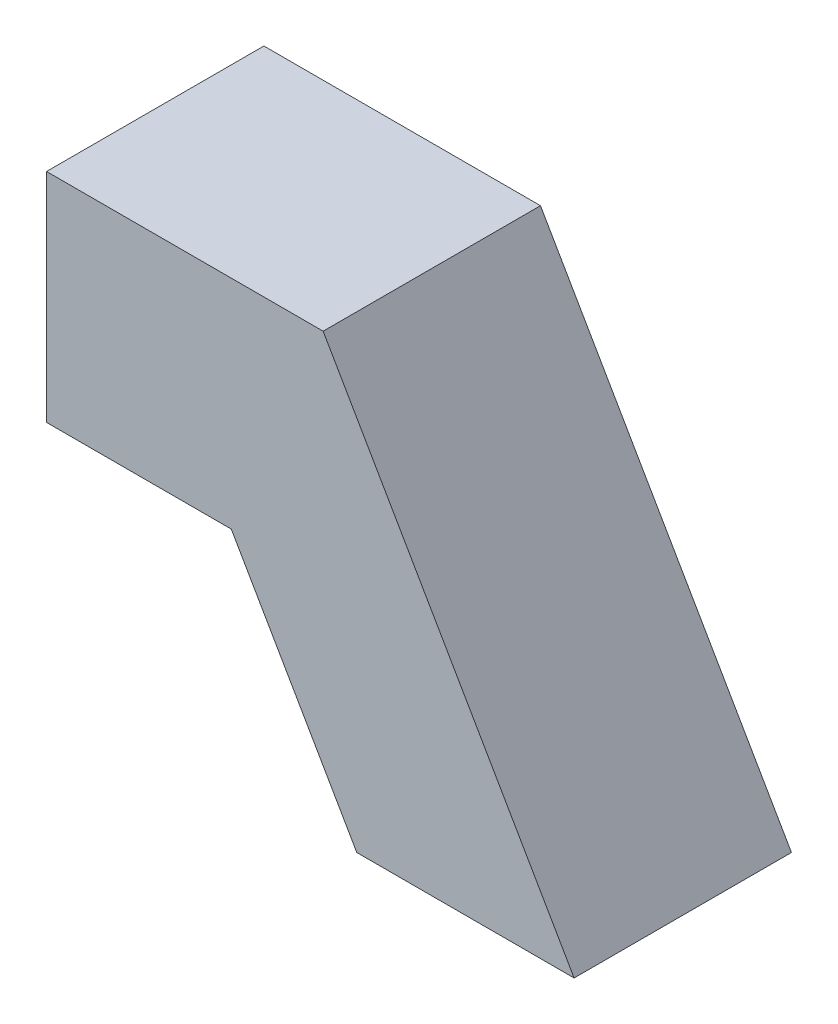
ISO-10303-21;
HEADER;
FILE_DESCRIPTION(('STEP AP214'),'2;1');
FILE_NAME('part.step','',(''),(''),'','','');
FILE_SCHEMA(('AUTOMOTIVE_DESIGN { 1 0 10303 214 1 1 1 1 }'));
ENDSEC;
DATA;
#1=APPLICATION_CONTEXT('core data for automotive mechanical design processes');
#2=APPLICATION_PROTOCOL_DEFINITION('international standard','automotive_design',2000,#1);
#3=PRODUCT_CONTEXT('',#1,'mechanical');
#4=PRODUCT('Part','Part','',(#3));
#5=PRODUCT_RELATED_PRODUCT_CATEGORY('part','',(#4));
#6=PRODUCT_DEFINITION_FORMATION('','',#4);
#7=PRODUCT_DEFINITION_CONTEXT('part definition',#1,'design');
#8=PRODUCT_DEFINITION('design','',#6,#7);
#9=PRODUCT_DEFINITION_SHAPE('','',#8);
#10=(LENGTH_UNIT() NAMED_UNIT(*) SI_UNIT(.MILLI.,.METRE.));
#11=(NAMED_UNIT(*) PLANE_ANGLE_UNIT() SI_UNIT($,.RADIAN.));
#12=(NAMED_UNIT(*) SI_UNIT($,.STERADIAN.) SOLID_ANGLE_UNIT());
#13=UNCERTAINTY_MEASURE_WITH_UNIT(LENGTH_MEASURE(1.E-05),#10,'distance_accuracy_value','');
#14=(GEOMETRIC_REPRESENTATION_CONTEXT(3) GLOBAL_UNCERTAINTY_ASSIGNED_CONTEXT((#13)) GLOBAL_UNIT_ASSIGNED_CONTEXT((#10,
#11,#12)) REPRESENTATION_CONTEXT('',''));
#15=CARTESIAN_POINT('',(0.,0.,0.));
#16=DIRECTION('',(0.,0.,1.));
#17=DIRECTION('',(1.,0.,0.));
#18=AXIS2_PLACEMENT_3D('',#15,#16,#17);
#19=CARTESIAN_POINT('',(0.,0.,20.));
#20=DIRECTION('',(0.,1.,0.));
#21=DIRECTION('',(0.,0.,1.));
#22=AXIS2_PLACEMENT_3D('',#19,#20,#21);
#23=PLANE('',#22);
#24=DIRECTION('',(1.,0.,0.));
#25=VECTOR('',#24,1.);
#26=CARTESIAN_POINT('',(0.,0.,0.));
#27=LINE('',#26,#25);
#28=CARTESIAN_POINT('',(0.,0.,0.));
#29=VERTEX_POINT('',#28);
#30=CARTESIAN_POINT('',(17.,0.,0.));
#31=VERTEX_POINT('',#30);
#32=EDGE_CURVE('E134',#29,#31,#27,.T.);
#33=ORIENTED_EDGE('',*,*,#32,.T.);
#34=DIRECTION('',(0.,0.,-1.));
#35=VECTOR('',#34,1.);
#36=CARTESIAN_POINT('',(17.,0.,20.));
#37=LINE('',#36,#35);
#38=CARTESIAN_POINT('',(17.,0.,20.));
#39=VERTEX_POINT('',#38);
#40=EDGE_CURVE('E11',#39,#31,#37,.T.);
#41=ORIENTED_EDGE('',*,*,#40,.F.);
#42=DIRECTION('',(1.,0.,0.));
#43=VECTOR('',#42,1.);
#44=CARTESIAN_POINT('',(0.,0.,20.));
#45=LINE('',#44,#43);
#46=CARTESIAN_POINT('',(0.,0.,20.));
#47=VERTEX_POINT('',#46);
#48=EDGE_CURVE('E150',#47,#39,#45,.T.);
#49=ORIENTED_EDGE('',*,*,#48,.F.);
#50=DIRECTION('',(0.,0.,-1.));
#51=VECTOR('',#50,1.);
#52=CARTESIAN_POINT('',(0.,0.,20.));
#53=LINE('',#52,#51);
#54=EDGE_CURVE('E130',#47,#29,#53,.T.);
#55=ORIENTED_EDGE('',*,*,#54,.T.);
#56=EDGE_LOOP('',(#33,#41,#49,#55));
#57=FACE_BOUND('',#56,.T.);
#58=ADVANCED_FACE('F45',(#57),#23,.F.);
#59=CARTESIAN_POINT('',(17.,0.,20.));
#60=DIRECTION('',(0.86602540378444,0.499999999999998,0.));
#61=DIRECTION('',(-0.499999999999998,0.86602540378444,0.));
#62=AXIS2_PLACEMENT_3D('',#59,#60,#61);
#63=PLANE('',#62);
#64=DIRECTION('',(0.499999999999998,-0.86602540378444,0.));
#65=VECTOR('',#64,1.);
#66=CARTESIAN_POINT('',(17.,0.,0.));
#67=LINE('',#66,#65);
#68=CARTESIAN_POINT('',(28.5470053837925,-20.,0.));
#69=VERTEX_POINT('',#68);
#70=EDGE_CURVE('E138',#31,#69,#67,.T.);
#71=ORIENTED_EDGE('',*,*,#70,.T.);
#72=DIRECTION('',(0.,0.,-1.));
#73=VECTOR('',#72,1.);
#74=CARTESIAN_POINT('',(28.5470053837925,-20.,20.));
#75=LINE('',#74,#73);
#76=CARTESIAN_POINT('',(28.5470053837925,-20.,20.));
#77=VERTEX_POINT('',#76);
#78=EDGE_CURVE('E54',#77,#69,#75,.T.);
#79=ORIENTED_EDGE('',*,*,#78,.F.);
#80=DIRECTION('',(0.499999999999998,-0.86602540378444,0.));
#81=VECTOR('',#80,1.);
#82=CARTESIAN_POINT('',(17.,0.,20.));
#83=LINE('',#82,#81);
#84=EDGE_CURVE('E99',#39,#77,#83,.T.);
#85=ORIENTED_EDGE('',*,*,#84,.F.);
#86=ORIENTED_EDGE('',*,*,#40,.T.);
#87=EDGE_LOOP('',(#71,#79,#85,#86));
#88=FACE_BOUND('',#87,.T.);
#89=ADVANCED_FACE('F178',(#88),#63,.F.);
#90=CARTESIAN_POINT('',(48.5470053837925,-20.,20.));
#91=DIRECTION('',(0.,1.,0.));
#92=DIRECTION('',(0.,0.,1.));
#93=AXIS2_PLACEMENT_3D('',#90,#91,#92);
#94=PLANE('',#93);
#95=DIRECTION('',(1.,0.,0.));
#96=VECTOR('',#95,1.);
#97=CARTESIAN_POINT('',(48.5470053837925,-20.,0.));
#98=LINE('',#97,#96);
#99=CARTESIAN_POINT('',(48.5470053837925,-20.,0.));
#100=VERTEX_POINT('',#99);
#101=EDGE_CURVE('E141',#69,#100,#98,.T.);
#102=ORIENTED_EDGE('',*,*,#101,.T.);
#103=DIRECTION('',(0.,0.,-1.));
#104=VECTOR('',#103,1.);
#105=CARTESIAN_POINT('',(48.5470053837925,-20.,20.));
#106=LINE('',#105,#104);
#107=CARTESIAN_POINT('',(48.5470053837925,-20.,20.));
#108=VERTEX_POINT('',#107);
#109=EDGE_CURVE('E123',#108,#100,#106,.T.);
#110=ORIENTED_EDGE('',*,*,#109,.F.);
#111=DIRECTION('',(1.,0.,0.));
#112=VECTOR('',#111,1.);
#113=CARTESIAN_POINT('',(48.5470053837925,-20.,20.));
#114=LINE('',#113,#112);
#115=EDGE_CURVE('E112',#77,#108,#114,.T.);
#116=ORIENTED_EDGE('',*,*,#115,.F.);
#117=ORIENTED_EDGE('',*,*,#78,.T.);
#118=EDGE_LOOP('',(#102,#110,#116,#117));
#119=FACE_BOUND('',#118,.T.);
#120=ADVANCED_FACE('F160',(#119),#94,.F.);
#121=CARTESIAN_POINT('',(25.4529946162076,20.,20.));
#122=DIRECTION('',(-0.86602540378444,-0.499999999999998,0.));
#123=DIRECTION('',(0.499999999999998,-0.86602540378444,0.));
#124=AXIS2_PLACEMENT_3D('',#121,#122,#123);
#125=PLANE('',#124);
#126=DIRECTION('',(-0.499999999999998,0.86602540378444,0.));
#127=VECTOR('',#126,1.);
#128=CARTESIAN_POINT('',(25.4529946162076,20.,0.));
#129=LINE('',#128,#127);
#130=CARTESIAN_POINT('',(25.4529946162076,20.,0.));
#131=VERTEX_POINT('',#130);
#132=EDGE_CURVE('E121',#100,#131,#129,.T.);
#133=ORIENTED_EDGE('',*,*,#132,.T.);
#134=DIRECTION('',(0.,0.,-1.));
#135=VECTOR('',#134,1.);
#136=CARTESIAN_POINT('',(25.4529946162076,20.,20.));
#137=LINE('',#136,#135);
#138=CARTESIAN_POINT('',(25.4529946162076,20.,20.));
#139=VERTEX_POINT('',#138);
#140=EDGE_CURVE('E118',#139,#131,#137,.T.);
#141=ORIENTED_EDGE('',*,*,#140,.F.);
#142=DIRECTION('',(-0.499999999999998,0.86602540378444,0.));
#143=VECTOR('',#142,1.);
#144=CARTESIAN_POINT('',(25.4529946162076,20.,20.));
#145=LINE('',#144,#143);
#146=EDGE_CURVE('E106',#108,#139,#145,.T.);
#147=ORIENTED_EDGE('',*,*,#146,.F.);
#148=ORIENTED_EDGE('',*,*,#109,.T.);
#149=EDGE_LOOP('',(#133,#141,#147,#148));
#150=FACE_BOUND('',#149,.T.);
#151=ADVANCED_FACE('F119',(#150),#125,.F.);
#152=CARTESIAN_POINT('',(0.,20.,20.));
#153=DIRECTION('',(0.,-1.,0.));
#154=DIRECTION('',(0.,0.,-1.));
#155=AXIS2_PLACEMENT_3D('',#152,#153,#154);
#156=PLANE('',#155);
#157=DIRECTION('',(-1.,0.,0.));
#158=VECTOR('',#157,1.);
#159=CARTESIAN_POINT('',(0.,20.,0.));
#160=LINE('',#159,#158);
#161=CARTESIAN_POINT('',(0.,20.,0.));
#162=VERTEX_POINT('',#161);
#163=EDGE_CURVE('E85',#131,#162,#160,.T.);
#164=ORIENTED_EDGE('',*,*,#163,.T.);
#165=DIRECTION('',(0.,0.,-1.));
#166=VECTOR('',#165,1.);
#167=CARTESIAN_POINT('',(0.,20.,20.));
#168=LINE('',#167,#166);
#169=CARTESIAN_POINT('',(0.,20.,20.));
#170=VERTEX_POINT('',#169);
#171=EDGE_CURVE('E124',#170,#162,#168,.T.);
#172=ORIENTED_EDGE('',*,*,#171,.F.);
#173=DIRECTION('',(-1.,0.,0.));
#174=VECTOR('',#173,1.);
#175=CARTESIAN_POINT('',(0.,20.,20.));
#176=LINE('',#175,#174);
#177=EDGE_CURVE('E110',#139,#170,#176,.T.);
#178=ORIENTED_EDGE('',*,*,#177,.F.);
#179=ORIENTED_EDGE('',*,*,#140,.T.);
#180=EDGE_LOOP('',(#164,#172,#178,#179));
#181=FACE_BOUND('',#180,.T.);
#182=ADVANCED_FACE('F126',(#181),#156,.F.);
#183=CARTESIAN_POINT('',(0.,0.,20.));
#184=DIRECTION('',(1.,0.,0.));
#185=DIRECTION('',(0.,0.,-1.));
#186=AXIS2_PLACEMENT_3D('',#183,#184,#185);
#187=PLANE('',#186);
#188=DIRECTION('',(0.,-1.,0.));
#189=VECTOR('',#188,1.);
#190=CARTESIAN_POINT('',(0.,0.,0.));
#191=LINE('',#190,#189);
#192=EDGE_CURVE('E91',#162,#29,#191,.T.);
#193=ORIENTED_EDGE('',*,*,#192,.T.);
#194=ORIENTED_EDGE('',*,*,#54,.F.);
#195=DIRECTION('',(0.,-1.,0.));
#196=VECTOR('',#195,1.);
#197=CARTESIAN_POINT('',(0.,0.,20.));
#198=LINE('',#197,#196);
#199=EDGE_CURVE('E62',#170,#47,#198,.T.);
#200=ORIENTED_EDGE('',*,*,#199,.F.);
#201=ORIENTED_EDGE('',*,*,#171,.T.);
#202=EDGE_LOOP('',(#193,#194,#200,#201));
#203=FACE_BOUND('',#202,.T.);
#204=ADVANCED_FACE('F167',(#203),#187,.F.);
#205=CARTESIAN_POINT('',(0.,0.,20.));
#206=DIRECTION('',(0.,0.,1.));
#207=DIRECTION('',(1.,0.,0.));
#208=AXIS2_PLACEMENT_3D('',#205,#206,#207);
#209=PLANE('',#208);
#210=ORIENTED_EDGE('',*,*,#48,.T.);
#211=ORIENTED_EDGE('',*,*,#84,.T.);
#212=ORIENTED_EDGE('',*,*,#115,.T.);
#213=ORIENTED_EDGE('',*,*,#146,.T.);
#214=ORIENTED_EDGE('',*,*,#177,.T.);
#215=ORIENTED_EDGE('',*,*,#199,.T.);
#216=EDGE_LOOP('',(#210,#211,#212,#213,#214,#215));
#217=FACE_BOUND('',#216,.T.);
#218=ADVANCED_FACE('F108',(#217),#209,.T.);
#219=CARTESIAN_POINT('',(0.,0.,0.));
#220=DIRECTION('',(0.,0.,1.));
#221=DIRECTION('',(1.,0.,0.));
#222=AXIS2_PLACEMENT_3D('',#219,#220,#221);
#223=PLANE('',#222);
#224=ORIENTED_EDGE('',*,*,#32,.F.);
#225=ORIENTED_EDGE('',*,*,#192,.F.);
#226=ORIENTED_EDGE('',*,*,#163,.F.);
#227=ORIENTED_EDGE('',*,*,#132,.F.);
#228=ORIENTED_EDGE('',*,*,#101,.F.);
#229=ORIENTED_EDGE('',*,*,#70,.F.);
#230=EDGE_LOOP('',(#224,#225,#226,#227,#228,#229));
#231=FACE_BOUND('',#230,.T.);
#232=ADVANCED_FACE('F163',(#231),#223,.F.);
#233=CLOSED_SHELL('',(#58,#89,#120,#151,#182,#204,#218,#232));
#234=MANIFOLD_SOLID_BREP('B2',#233);
#235=ADVANCED_BREP_SHAPE_REPRESENTATION('',(#18,#234),#14);
#236=SHAPE_DEFINITION_REPRESENTATION(#9,#235);
ENDSEC;
END-ISO-10303-21;
